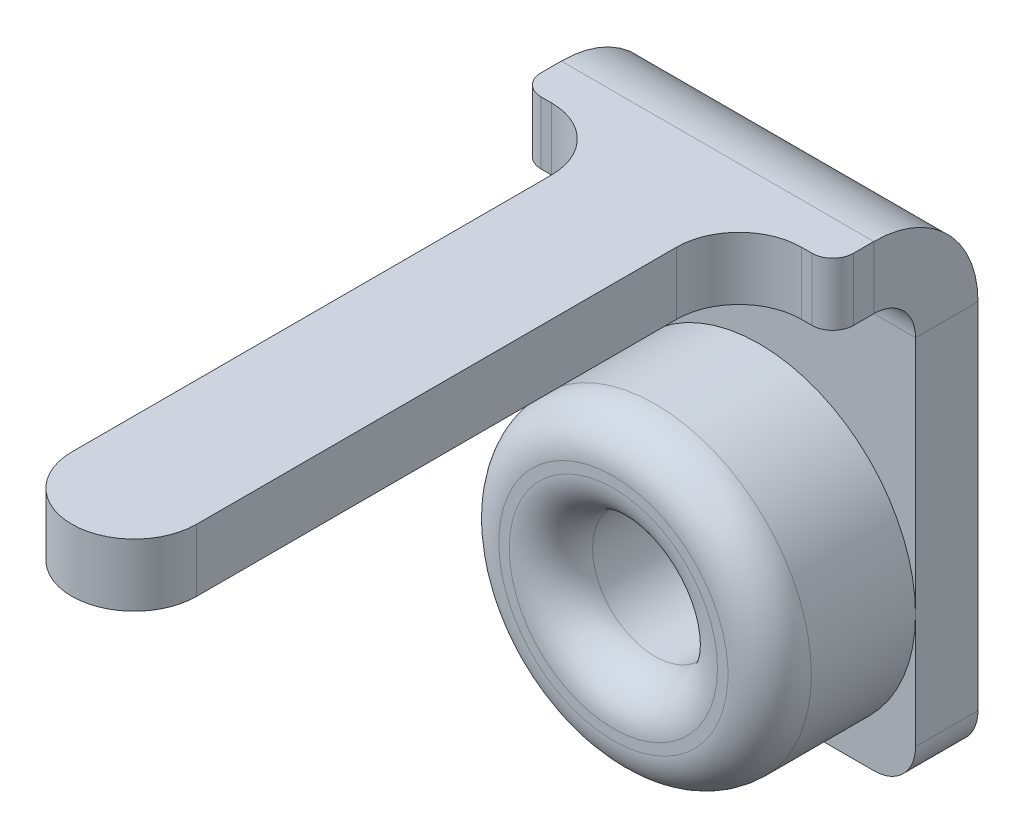
ISO-10303-21;
HEADER;
FILE_DESCRIPTION(('STEP AP214'),'2;1');
FILE_NAME('part.step','',(''),(''),'','','');
FILE_SCHEMA(('AUTOMOTIVE_DESIGN { 1 0 10303 214 1 1 1 1 }'));
ENDSEC;
DATA;
#1=APPLICATION_CONTEXT('core data for automotive mechanical design processes');
#2=APPLICATION_PROTOCOL_DEFINITION('international standard','automotive_design',2000,#1);
#3=PRODUCT_CONTEXT('',#1,'mechanical');
#4=PRODUCT('Part','Part','',(#3));
#5=PRODUCT_RELATED_PRODUCT_CATEGORY('part','',(#4));
#6=PRODUCT_DEFINITION_FORMATION('','',#4);
#7=PRODUCT_DEFINITION_CONTEXT('part definition',#1,'design');
#8=PRODUCT_DEFINITION('design','',#6,#7);
#9=PRODUCT_DEFINITION_SHAPE('','',#8);
#10=(LENGTH_UNIT() NAMED_UNIT(*) SI_UNIT(.MILLI.,.METRE.));
#11=(NAMED_UNIT(*) PLANE_ANGLE_UNIT() SI_UNIT($,.RADIAN.));
#12=(NAMED_UNIT(*) SI_UNIT($,.STERADIAN.) SOLID_ANGLE_UNIT());
#13=UNCERTAINTY_MEASURE_WITH_UNIT(LENGTH_MEASURE(1.E-05),#10,'distance_accuracy_value','');
#14=(GEOMETRIC_REPRESENTATION_CONTEXT(3) GLOBAL_UNCERTAINTY_ASSIGNED_CONTEXT((#13)) GLOBAL_UNIT_ASSIGNED_CONTEXT((#10,
#11,#12)) REPRESENTATION_CONTEXT('',''));
#15=CARTESIAN_POINT('',(0.,0.,0.));
#16=DIRECTION('',(0.,0.,1.));
#17=DIRECTION('',(1.,0.,0.));
#18=AXIS2_PLACEMENT_3D('',#15,#16,#17);
#19=CARTESIAN_POINT('',(0.,0.,0.8));
#20=DIRECTION('',(0.,0.,-1.));
#21=DIRECTION('',(0.,1.,0.));
#22=AXIS2_PLACEMENT_3D('',#19,#20,#21);
#23=TOROIDAL_SURFACE('',#22,0.5,0.2);
#24=CARTESIAN_POINT('',(0.,0.,1.));
#25=DIRECTION('',(0.,0.,-1.));
#26=DIRECTION('',(0.,1.,0.));
#27=AXIS2_PLACEMENT_3D('',#24,#25,#26);
#28=CIRCLE('',#27,0.5);
#29=CARTESIAN_POINT('',(0.,0.5,1.));
#30=VERTEX_POINT('',#29);
#31=EDGE_CURVE('E167',#30,#30,#28,.T.);
#32=ORIENTED_EDGE('',*,*,#31,.F.);
#33=EDGE_LOOP('',(#32));
#34=FACE_BOUND('',#33,.T.);
#35=CARTESIAN_POINT('',(0.,0.,0.8));
#36=DIRECTION('',(0.,0.,-1.));
#37=DIRECTION('',(0.,1.,0.));
#38=AXIS2_PLACEMENT_3D('',#35,#36,#37);
#39=CIRCLE('',#38,0.3);
#40=CARTESIAN_POINT('',(0.,0.3,0.8));
#41=VERTEX_POINT('',#40);
#42=EDGE_CURVE('E328',#41,#41,#39,.T.);
#43=ORIENTED_EDGE('',*,*,#42,.T.);
#44=EDGE_LOOP('',(#43));
#45=FACE_BOUND('',#44,.T.);
#46=ADVANCED_FACE('F17',(#34,#45),#23,.T.);
#47=CARTESIAN_POINT('',(0.,0.,0.2));
#48=DIRECTION('',(0.,0.,-1.));
#49=DIRECTION('',(0.,1.,0.));
#50=AXIS2_PLACEMENT_3D('',#47,#48,#49);
#51=TOROIDAL_SURFACE('',#50,0.5,0.2);
#52=CARTESIAN_POINT('',(0.,0.,0.));
#53=DIRECTION('',(0.,0.,1.));
#54=DIRECTION('',(0.,1.,0.));
#55=AXIS2_PLACEMENT_3D('',#52,#53,#54);
#56=CIRCLE('',#55,0.5);
#57=CARTESIAN_POINT('',(0.,0.5,0.));
#58=VERTEX_POINT('',#57);
#59=EDGE_CURVE('E255',#58,#58,#56,.T.);
#60=ORIENTED_EDGE('',*,*,#59,.F.);
#61=EDGE_LOOP('',(#60));
#62=FACE_BOUND('',#61,.T.);
#63=CARTESIAN_POINT('',(0.,0.,0.2));
#64=DIRECTION('',(0.,0.,1.));
#65=DIRECTION('',(0.,1.,0.));
#66=AXIS2_PLACEMENT_3D('',#63,#64,#65);
#67=CIRCLE('',#66,0.3);
#68=CARTESIAN_POINT('',(0.,0.3,0.2));
#69=VERTEX_POINT('',#68);
#70=EDGE_CURVE('E332',#69,#69,#67,.T.);
#71=ORIENTED_EDGE('',*,*,#70,.T.);
#72=EDGE_LOOP('',(#71));
#73=FACE_BOUND('',#72,.T.);
#74=ADVANCED_FACE('F703',(#62,#73),#51,.T.);
#75=CARTESIAN_POINT('',(0.75,1.15,0.));
#76=DIRECTION('',(1.,0.,0.));
#77=DIRECTION('',(0.,-1.,0.));
#78=AXIS2_PLACEMENT_3D('',#75,#76,#77);
#79=PLANE('',#78);
#80=CARTESIAN_POINT('',(0.75,1.15,0.5));
#81=DIRECTION('',(1.,0.,0.));
#82=DIRECTION('',(0.,0.,-1.));
#83=AXIS2_PLACEMENT_3D('',#80,#81,#82);
#84=CIRCLE('',#83,0.5);
#85=CARTESIAN_POINT('',(0.75,1.15,0.));
#86=VERTEX_POINT('',#85);
#87=CARTESIAN_POINT('',(0.75,1.65,0.5));
#88=VERTEX_POINT('',#87);
#89=EDGE_CURVE('E400',#86,#88,#84,.T.);
#90=ORIENTED_EDGE('',*,*,#89,.T.);
#91=DIRECTION('',(0.,1.,0.));
#92=VECTOR('',#91,1.);
#93=CARTESIAN_POINT('',(0.75,1.35,0.5));
#94=LINE('',#93,#92);
#95=CARTESIAN_POINT('',(0.75,1.35,0.5));
#96=VERTEX_POINT('',#95);
#97=EDGE_CURVE('E171',#96,#88,#94,.T.);
#98=ORIENTED_EDGE('',*,*,#97,.F.);
#99=CARTESIAN_POINT('',(0.75,1.15,0.5));
#100=DIRECTION('',(1.,0.,0.));
#101=DIRECTION('',(0.,0.,-1.));
#102=AXIS2_PLACEMENT_3D('',#99,#100,#101);
#103=CIRCLE('',#102,0.2);
#104=CARTESIAN_POINT('',(0.75,1.15,0.3));
#105=VERTEX_POINT('',#104);
#106=EDGE_CURVE('E244',#105,#96,#103,.T.);
#107=ORIENTED_EDGE('',*,*,#106,.F.);
#108=DIRECTION('',(0.,0.,-1.));
#109=VECTOR('',#108,1.);
#110=CARTESIAN_POINT('',(0.75,1.15,0.3));
#111=LINE('',#110,#109);
#112=EDGE_CURVE('E261',#105,#86,#111,.T.);
#113=ORIENTED_EDGE('',*,*,#112,.T.);
#114=EDGE_LOOP('',(#90,#98,#107,#113));
#115=FACE_BOUND('',#114,.T.);
#116=ADVANCED_FACE('F709',(#115),#79,.T.);
#117=CARTESIAN_POINT('',(-0.75,1.15,0.3));
#118=DIRECTION('',(-1.,0.,0.));
#119=DIRECTION('',(0.,0.,1.));
#120=AXIS2_PLACEMENT_3D('',#117,#118,#119);
#121=PLANE('',#120);
#122=CARTESIAN_POINT('',(-0.75,1.15,0.5));
#123=DIRECTION('',(-1.,0.,0.));
#124=DIRECTION('',(0.,1.,0.));
#125=AXIS2_PLACEMENT_3D('',#122,#123,#124);
#126=CIRCLE('',#125,0.2);
#127=CARTESIAN_POINT('',(-0.75,1.35,0.5));
#128=VERTEX_POINT('',#127);
#129=CARTESIAN_POINT('',(-0.75,1.15,0.3));
#130=VERTEX_POINT('',#129);
#131=EDGE_CURVE('E241',#128,#130,#126,.T.);
#132=ORIENTED_EDGE('',*,*,#131,.F.);
#133=DIRECTION('',(0.,1.,0.));
#134=VECTOR('',#133,1.);
#135=CARTESIAN_POINT('',(-0.75,1.35,0.5));
#136=LINE('',#135,#134);
#137=CARTESIAN_POINT('',(-0.75,1.65,0.5));
#138=VERTEX_POINT('',#137);
#139=EDGE_CURVE('E338',#128,#138,#136,.T.);
#140=ORIENTED_EDGE('',*,*,#139,.T.);
#141=CARTESIAN_POINT('',(-0.75,1.15,0.5));
#142=DIRECTION('',(-1.,0.,0.));
#143=DIRECTION('',(0.,1.,0.));
#144=AXIS2_PLACEMENT_3D('',#141,#142,#143);
#145=CIRCLE('',#144,0.5);
#146=CARTESIAN_POINT('',(-0.75,1.15,0.));
#147=VERTEX_POINT('',#146);
#148=EDGE_CURVE('E179',#138,#147,#145,.T.);
#149=ORIENTED_EDGE('',*,*,#148,.T.);
#150=DIRECTION('',(0.,0.,-1.));
#151=VECTOR('',#150,1.);
#152=CARTESIAN_POINT('',(-0.75,1.15,0.3));
#153=LINE('',#152,#151);
#154=EDGE_CURVE('E196',#130,#147,#153,.T.);
#155=ORIENTED_EDGE('',*,*,#154,.F.);
#156=EDGE_LOOP('',(#132,#140,#149,#155));
#157=FACE_BOUND('',#156,.T.);
#158=ADVANCED_FACE('F371',(#157),#121,.T.);
#159=CARTESIAN_POINT('',(0.,1.65,-1.15265482457437));
#160=DIRECTION('',(0.,-1.,0.));
#161=DIRECTION('',(0.,0.,-1.));
#162=AXIS2_PLACEMENT_3D('',#159,#160,#161);
#163=PLANE('',#162);
#164=DIRECTION('',(-1.,0.,0.));
#165=VECTOR('',#164,1.);
#166=CARTESIAN_POINT('',(0.75,1.65,0.5));
#167=LINE('',#166,#165);
#168=EDGE_CURVE('E21',#88,#138,#167,.T.);
#169=ORIENTED_EDGE('',*,*,#168,.T.);
#170=DIRECTION('',(0.,0.,-1.));
#171=VECTOR('',#170,1.);
#172=CARTESIAN_POINT('',(-0.75,1.65,0.597345175425633));
#173=LINE('',#172,#171);
#174=CARTESIAN_POINT('',(-0.75,1.65,0.597345175425633));
#175=VERTEX_POINT('',#174);
#176=EDGE_CURVE('E218',#175,#138,#173,.T.);
#177=ORIENTED_EDGE('',*,*,#176,.F.);
#178=CARTESIAN_POINT('',(-0.65,1.65,0.597345175425633));
#179=DIRECTION('',(0.,-1.,0.));
#180=DIRECTION('',(0.,0.,1.));
#181=AXIS2_PLACEMENT_3D('',#178,#179,#180);
#182=CIRCLE('',#181,0.1);
#183=CARTESIAN_POINT('',(-0.65,1.65,0.697345175425633));
#184=VERTEX_POINT('',#183);
#185=EDGE_CURVE('E214',#184,#175,#182,.T.);
#186=ORIENTED_EDGE('',*,*,#185,.F.);
#187=DIRECTION('',(-1.,0.,0.));
#188=VECTOR('',#187,1.);
#189=CARTESIAN_POINT('',(-0.6,1.65,0.697345175425633));
#190=LINE('',#189,#188);
#191=CARTESIAN_POINT('',(-0.6,1.65,0.697345175425633));
#192=VERTEX_POINT('',#191);
#193=EDGE_CURVE('E197',#192,#184,#190,.T.);
#194=ORIENTED_EDGE('',*,*,#193,.F.);
#195=CARTESIAN_POINT('',(-0.6,1.65,0.997345175425634));
#196=DIRECTION('',(0.,1.,0.));
#197=DIRECTION('',(1.,0.,0.));
#198=AXIS2_PLACEMENT_3D('',#195,#196,#197);
#199=CIRCLE('',#198,0.3);
#200=CARTESIAN_POINT('',(-0.3,1.65,0.997345175425634));
#201=VERTEX_POINT('',#200);
#202=EDGE_CURVE('E233',#201,#192,#199,.T.);
#203=ORIENTED_EDGE('',*,*,#202,.F.);
#204=DIRECTION('',(0.,0.,-1.));
#205=VECTOR('',#204,1.);
#206=CARTESIAN_POINT('',(-0.3,1.65,3.30000017542563));
#207=LINE('',#206,#205);
#208=CARTESIAN_POINT('',(-0.3,1.65,3.30000017542563));
#209=VERTEX_POINT('',#208);
#210=EDGE_CURVE('E185',#209,#201,#207,.T.);
#211=ORIENTED_EDGE('',*,*,#210,.F.);
#212=CARTESIAN_POINT('',(0.,1.65,3.30000017542563));
#213=DIRECTION('',(0.,-1.,0.));
#214=DIRECTION('',(1.,0.,0.));
#215=AXIS2_PLACEMENT_3D('',#212,#213,#214);
#216=CIRCLE('',#215,0.3);
#217=CARTESIAN_POINT('',(0.3,1.65,3.30000017542563));
#218=VERTEX_POINT('',#217);
#219=EDGE_CURVE('E271',#218,#209,#216,.T.);
#220=ORIENTED_EDGE('',*,*,#219,.F.);
#221=DIRECTION('',(0.,0.,1.));
#222=VECTOR('',#221,1.);
#223=CARTESIAN_POINT('',(0.3,1.65,0.997345175425632));
#224=LINE('',#223,#222);
#225=CARTESIAN_POINT('',(0.3,1.65,0.997345175425632));
#226=VERTEX_POINT('',#225);
#227=EDGE_CURVE('E533',#226,#218,#224,.T.);
#228=ORIENTED_EDGE('',*,*,#227,.F.);
#229=CARTESIAN_POINT('',(0.6,1.65,0.997345175425633));
#230=DIRECTION('',(0.,1.,0.));
#231=DIRECTION('',(0.,0.,-1.));
#232=AXIS2_PLACEMENT_3D('',#229,#230,#231);
#233=CIRCLE('',#232,0.3);
#234=CARTESIAN_POINT('',(0.6,1.65,0.697345175425633));
#235=VERTEX_POINT('',#234);
#236=EDGE_CURVE('E347',#235,#226,#233,.T.);
#237=ORIENTED_EDGE('',*,*,#236,.F.);
#238=DIRECTION('',(-1.,0.,0.));
#239=VECTOR('',#238,1.);
#240=CARTESIAN_POINT('',(0.65,1.65,0.697345175425633));
#241=LINE('',#240,#239);
#242=CARTESIAN_POINT('',(0.65,1.65,0.697345175425633));
#243=VERTEX_POINT('',#242);
#244=EDGE_CURVE('E157',#243,#235,#241,.T.);
#245=ORIENTED_EDGE('',*,*,#244,.F.);
#246=CARTESIAN_POINT('',(0.65,1.65,0.597345175425633));
#247=DIRECTION('',(0.,-1.,0.));
#248=DIRECTION('',(1.,0.,0.));
#249=AXIS2_PLACEMENT_3D('',#246,#247,#248);
#250=CIRCLE('',#249,0.1);
#251=CARTESIAN_POINT('',(0.75,1.65,0.597345175425633));
#252=VERTEX_POINT('',#251);
#253=EDGE_CURVE('E11',#252,#243,#250,.T.);
#254=ORIENTED_EDGE('',*,*,#253,.F.);
#255=DIRECTION('',(0.,0.,1.));
#256=VECTOR('',#255,1.);
#257=CARTESIAN_POINT('',(0.75,1.65,0.5));
#258=LINE('',#257,#256);
#259=EDGE_CURVE('E154',#88,#252,#258,.T.);
#260=ORIENTED_EDGE('',*,*,#259,.F.);
#261=EDGE_LOOP('',(#169,#177,#186,#194,#203,#211,#220,#228,#237,#245,#254,#260));
#262=FACE_BOUND('',#261,.T.);
#263=ADVANCED_FACE('F152',(#262),#163,.F.);
#264=CARTESIAN_POINT('',(0.65,1.65,0.597345175425633));
#265=DIRECTION('',(0.,-1.,0.));
#266=DIRECTION('',(1.,0.,0.));
#267=AXIS2_PLACEMENT_3D('',#264,#265,#266);
#268=CYLINDRICAL_SURFACE('',#267,0.1);
#269=ORIENTED_EDGE('',*,*,#253,.T.);
#270=DIRECTION('',(0.,-1.,0.));
#271=VECTOR('',#270,1.);
#272=CARTESIAN_POINT('',(0.65,1.65,0.697345175425633));
#273=LINE('',#272,#271);
#274=CARTESIAN_POINT('',(0.65,1.35,0.697345175425633));
#275=VERTEX_POINT('',#274);
#276=EDGE_CURVE('E28',#243,#275,#273,.T.);
#277=ORIENTED_EDGE('',*,*,#276,.T.);
#278=CARTESIAN_POINT('',(0.65,1.35,0.597345175425633));
#279=DIRECTION('',(0.,-1.,0.));
#280=DIRECTION('',(1.,0.,0.));
#281=AXIS2_PLACEMENT_3D('',#278,#279,#280);
#282=CIRCLE('',#281,0.1);
#283=CARTESIAN_POINT('',(0.75,1.35,0.597345175425633));
#284=VERTEX_POINT('',#283);
#285=EDGE_CURVE('E162',#284,#275,#282,.T.);
#286=ORIENTED_EDGE('',*,*,#285,.F.);
#287=DIRECTION('',(0.,-1.,0.));
#288=VECTOR('',#287,1.);
#289=CARTESIAN_POINT('',(0.75,1.65,0.597345175425633));
#290=LINE('',#289,#288);
#291=EDGE_CURVE('E159',#252,#284,#290,.T.);
#292=ORIENTED_EDGE('',*,*,#291,.F.);
#293=EDGE_LOOP('',(#269,#277,#286,#292));
#294=FACE_BOUND('',#293,.T.);
#295=ADVANCED_FACE('F160',(#294),#268,.T.);
#296=CARTESIAN_POINT('',(0.65,1.65,0.697345175425633));
#297=DIRECTION('',(0.,0.,1.));
#298=DIRECTION('',(1.,0.,0.));
#299=AXIS2_PLACEMENT_3D('',#296,#297,#298);
#300=PLANE('',#299);
#301=ORIENTED_EDGE('',*,*,#244,.T.);
#302=DIRECTION('',(0.,-1.,0.));
#303=VECTOR('',#302,1.);
#304=CARTESIAN_POINT('',(0.6,1.65,0.697345175425633));
#305=LINE('',#304,#303);
#306=CARTESIAN_POINT('',(0.6,1.35,0.697345175425633));
#307=VERTEX_POINT('',#306);
#308=EDGE_CURVE('E270',#235,#307,#305,.T.);
#309=ORIENTED_EDGE('',*,*,#308,.T.);
#310=DIRECTION('',(-1.,0.,0.));
#311=VECTOR('',#310,1.);
#312=CARTESIAN_POINT('',(0.65,1.35,0.697345175425633));
#313=LINE('',#312,#311);
#314=EDGE_CURVE('E209',#275,#307,#313,.T.);
#315=ORIENTED_EDGE('',*,*,#314,.F.);
#316=ORIENTED_EDGE('',*,*,#276,.F.);
#317=EDGE_LOOP('',(#301,#309,#315,#316));
#318=FACE_BOUND('',#317,.T.);
#319=ADVANCED_FACE('F724',(#318),#300,.T.);
#320=CARTESIAN_POINT('',(0.6,1.65,0.997345175425633));
#321=DIRECTION('',(0.,1.,0.));
#322=DIRECTION('',(0.,0.,-1.));
#323=AXIS2_PLACEMENT_3D('',#320,#321,#322);
#324=CYLINDRICAL_SURFACE('',#323,0.3);
#325=ORIENTED_EDGE('',*,*,#236,.T.);
#326=DIRECTION('',(0.,-1.,0.));
#327=VECTOR('',#326,1.);
#328=CARTESIAN_POINT('',(0.3,1.65,0.997345175425632));
#329=LINE('',#328,#327);
#330=CARTESIAN_POINT('',(0.3,1.35,0.997345175425632));
#331=VERTEX_POINT('',#330);
#332=EDGE_CURVE('E351',#226,#331,#329,.T.);
#333=ORIENTED_EDGE('',*,*,#332,.T.);
#334=CARTESIAN_POINT('',(0.6,1.35,0.997345175425633));
#335=DIRECTION('',(0.,1.,0.));
#336=DIRECTION('',(0.,0.,-1.));
#337=AXIS2_PLACEMENT_3D('',#334,#335,#336);
#338=CIRCLE('',#337,0.3);
#339=EDGE_CURVE('E213',#307,#331,#338,.T.);
#340=ORIENTED_EDGE('',*,*,#339,.F.);
#341=ORIENTED_EDGE('',*,*,#308,.F.);
#342=EDGE_LOOP('',(#325,#333,#340,#341));
#343=FACE_BOUND('',#342,.T.);
#344=ADVANCED_FACE('F721',(#343),#324,.F.);
#345=CARTESIAN_POINT('',(0.3,1.65,0.997345175425632));
#346=DIRECTION('',(1.,0.,0.));
#347=DIRECTION('',(0.,0.,-1.));
#348=AXIS2_PLACEMENT_3D('',#345,#346,#347);
#349=PLANE('',#348);
#350=ORIENTED_EDGE('',*,*,#227,.T.);
#351=DIRECTION('',(0.,-1.,0.));
#352=VECTOR('',#351,1.);
#353=CARTESIAN_POINT('',(0.3,1.65,3.30000017542563));
#354=LINE('',#353,#352);
#355=CARTESIAN_POINT('',(0.3,1.35,3.30000017542563));
#356=VERTEX_POINT('',#355);
#357=EDGE_CURVE('E274',#218,#356,#354,.T.);
#358=ORIENTED_EDGE('',*,*,#357,.T.);
#359=DIRECTION('',(0.,0.,1.));
#360=VECTOR('',#359,1.);
#361=CARTESIAN_POINT('',(0.3,1.35,0.997345175425632));
#362=LINE('',#361,#360);
#363=EDGE_CURVE('E312',#331,#356,#362,.T.);
#364=ORIENTED_EDGE('',*,*,#363,.F.);
#365=ORIENTED_EDGE('',*,*,#332,.F.);
#366=EDGE_LOOP('',(#350,#358,#364,#365));
#367=FACE_BOUND('',#366,.T.);
#368=ADVANCED_FACE('F723',(#367),#349,.T.);
#369=CARTESIAN_POINT('',(0.,1.65,3.30000017542563));
#370=DIRECTION('',(0.,-1.,0.));
#371=DIRECTION('',(1.,0.,0.));
#372=AXIS2_PLACEMENT_3D('',#369,#370,#371);
#373=CYLINDRICAL_SURFACE('',#372,0.3);
#374=ORIENTED_EDGE('',*,*,#219,.T.);
#375=DIRECTION('',(0.,-1.,0.));
#376=VECTOR('',#375,1.);
#377=CARTESIAN_POINT('',(-0.3,1.65,3.30000017542563));
#378=LINE('',#377,#376);
#379=CARTESIAN_POINT('',(-0.3,1.35,3.30000017542563));
#380=VERTEX_POINT('',#379);
#381=EDGE_CURVE('E189',#209,#380,#378,.T.);
#382=ORIENTED_EDGE('',*,*,#381,.T.);
#383=CARTESIAN_POINT('',(0.,1.35,3.30000017542563));
#384=DIRECTION('',(0.,-1.,0.));
#385=DIRECTION('',(1.,0.,0.));
#386=AXIS2_PLACEMENT_3D('',#383,#384,#385);
#387=CIRCLE('',#386,0.3);
#388=EDGE_CURVE('E316',#356,#380,#387,.T.);
#389=ORIENTED_EDGE('',*,*,#388,.F.);
#390=ORIENTED_EDGE('',*,*,#357,.F.);
#391=EDGE_LOOP('',(#374,#382,#389,#390));
#392=FACE_BOUND('',#391,.T.);
#393=ADVANCED_FACE('F730',(#392),#373,.T.);
#394=CARTESIAN_POINT('',(-0.3,1.65,3.30000017542563));
#395=DIRECTION('',(-1.,0.,0.));
#396=DIRECTION('',(0.,0.,1.));
#397=AXIS2_PLACEMENT_3D('',#394,#395,#396);
#398=PLANE('',#397);
#399=ORIENTED_EDGE('',*,*,#210,.T.);
#400=DIRECTION('',(0.,-1.,0.));
#401=VECTOR('',#400,1.);
#402=CARTESIAN_POINT('',(-0.3,1.65,0.997345175425632));
#403=LINE('',#402,#401);
#404=CARTESIAN_POINT('',(-0.3,1.35,0.997345175425634));
#405=VERTEX_POINT('',#404);
#406=EDGE_CURVE('E190',#201,#405,#403,.T.);
#407=ORIENTED_EDGE('',*,*,#406,.T.);
#408=DIRECTION('',(0.,0.,-1.));
#409=VECTOR('',#408,1.);
#410=CARTESIAN_POINT('',(-0.3,1.35,3.30000017542563));
#411=LINE('',#410,#409);
#412=EDGE_CURVE('E327',#380,#405,#411,.T.);
#413=ORIENTED_EDGE('',*,*,#412,.F.);
#414=ORIENTED_EDGE('',*,*,#381,.F.);
#415=EDGE_LOOP('',(#399,#407,#413,#414));
#416=FACE_BOUND('',#415,.T.);
#417=ADVANCED_FACE('F636',(#416),#398,.T.);
#418=CARTESIAN_POINT('',(-0.6,1.65,0.997345175425634));
#419=DIRECTION('',(0.,1.,0.));
#420=DIRECTION('',(1.,0.,0.));
#421=AXIS2_PLACEMENT_3D('',#418,#419,#420);
#422=CYLINDRICAL_SURFACE('',#421,0.3);
#423=ORIENTED_EDGE('',*,*,#202,.T.);
#424=DIRECTION('',(0.,-1.,0.));
#425=VECTOR('',#424,1.);
#426=CARTESIAN_POINT('',(-0.6,1.65,0.697345175425633));
#427=LINE('',#426,#425);
#428=CARTESIAN_POINT('',(-0.6,1.35,0.697345175425633));
#429=VERTEX_POINT('',#428);
#430=EDGE_CURVE('E201',#192,#429,#427,.T.);
#431=ORIENTED_EDGE('',*,*,#430,.T.);
#432=CARTESIAN_POINT('',(-0.6,1.35,0.997345175425634));
#433=DIRECTION('',(0.,1.,0.));
#434=DIRECTION('',(1.,0.,0.));
#435=AXIS2_PLACEMENT_3D('',#432,#433,#434);
#436=CIRCLE('',#435,0.3);
#437=EDGE_CURVE('E522',#405,#429,#436,.T.);
#438=ORIENTED_EDGE('',*,*,#437,.F.);
#439=ORIENTED_EDGE('',*,*,#406,.F.);
#440=EDGE_LOOP('',(#423,#431,#438,#439));
#441=FACE_BOUND('',#440,.T.);
#442=ADVANCED_FACE('F619',(#441),#422,.F.);
#443=CARTESIAN_POINT('',(-0.6,1.65,0.697345175425633));
#444=DIRECTION('',(0.,0.,1.));
#445=DIRECTION('',(0.,-1.,0.));
#446=AXIS2_PLACEMENT_3D('',#443,#444,#445);
#447=PLANE('',#446);
#448=ORIENTED_EDGE('',*,*,#193,.T.);
#449=DIRECTION('',(0.,-1.,0.));
#450=VECTOR('',#449,1.);
#451=CARTESIAN_POINT('',(-0.65,1.65,0.697345175425633));
#452=LINE('',#451,#450);
#453=CARTESIAN_POINT('',(-0.65,1.35,0.697345175425633));
#454=VERTEX_POINT('',#453);
#455=EDGE_CURVE('E202',#184,#454,#452,.T.);
#456=ORIENTED_EDGE('',*,*,#455,.T.);
#457=DIRECTION('',(-1.,0.,0.));
#458=VECTOR('',#457,1.);
#459=CARTESIAN_POINT('',(-0.6,1.35,0.697345175425633));
#460=LINE('',#459,#458);
#461=EDGE_CURVE('E251',#429,#454,#460,.T.);
#462=ORIENTED_EDGE('',*,*,#461,.F.);
#463=ORIENTED_EDGE('',*,*,#430,.F.);
#464=EDGE_LOOP('',(#448,#456,#462,#463));
#465=FACE_BOUND('',#464,.T.);
#466=ADVANCED_FACE('F627',(#465),#447,.T.);
#467=CARTESIAN_POINT('',(-0.65,1.65,0.597345175425633));
#468=DIRECTION('',(0.,-1.,0.));
#469=DIRECTION('',(0.,0.,1.));
#470=AXIS2_PLACEMENT_3D('',#467,#468,#469);
#471=CYLINDRICAL_SURFACE('',#470,0.1);
#472=ORIENTED_EDGE('',*,*,#185,.T.);
#473=DIRECTION('',(0.,-1.,0.));
#474=VECTOR('',#473,1.);
#475=CARTESIAN_POINT('',(-0.75,1.65,0.597345175425633));
#476=LINE('',#475,#474);
#477=CARTESIAN_POINT('',(-0.75,1.35,0.597345175425633));
#478=VERTEX_POINT('',#477);
#479=EDGE_CURVE('E341',#175,#478,#476,.T.);
#480=ORIENTED_EDGE('',*,*,#479,.T.);
#481=CARTESIAN_POINT('',(-0.65,1.35,0.597345175425633));
#482=DIRECTION('',(0.,-1.,0.));
#483=DIRECTION('',(0.,0.,1.));
#484=AXIS2_PLACEMENT_3D('',#481,#482,#483);
#485=CIRCLE('',#484,0.1);
#486=EDGE_CURVE('E246',#454,#478,#485,.T.);
#487=ORIENTED_EDGE('',*,*,#486,.F.);
#488=ORIENTED_EDGE('',*,*,#455,.F.);
#489=EDGE_LOOP('',(#472,#480,#487,#488));
#490=FACE_BOUND('',#489,.T.);
#491=ADVANCED_FACE('F647',(#490),#471,.T.);
#492=CARTESIAN_POINT('',(-0.75,1.65,0.597345175425633));
#493=DIRECTION('',(-1.,0.,0.));
#494=DIRECTION('',(0.,1.,0.));
#495=AXIS2_PLACEMENT_3D('',#492,#493,#494);
#496=PLANE('',#495);
#497=ORIENTED_EDGE('',*,*,#139,.F.);
#498=DIRECTION('',(0.,0.,-1.));
#499=VECTOR('',#498,1.);
#500=CARTESIAN_POINT('',(-0.75,1.35,0.597345175425633));
#501=LINE('',#500,#499);
#502=EDGE_CURVE('E250',#478,#128,#501,.T.);
#503=ORIENTED_EDGE('',*,*,#502,.F.);
#504=ORIENTED_EDGE('',*,*,#479,.F.);
#505=ORIENTED_EDGE('',*,*,#176,.T.);
#506=EDGE_LOOP('',(#497,#503,#504,#505));
#507=FACE_BOUND('',#506,.T.);
#508=ADVANCED_FACE('F19',(#507),#496,.T.);
#509=CARTESIAN_POINT('',(0.,0.,1.));
#510=DIRECTION('',(0.,0.,1.));
#511=DIRECTION('',(1.,0.,0.));
#512=AXIS2_PLACEMENT_3D('',#509,#510,#511);
#513=PLANE('',#512);
#514=ORIENTED_EDGE('',*,*,#31,.T.);
#515=EDGE_LOOP('',(#514));
#516=FACE_BOUND('',#515,.T.);
#517=CARTESIAN_POINT('',(0.,0.,1.));
#518=DIRECTION('',(0.,0.,1.));
#519=DIRECTION('',(0.,1.,0.));
#520=AXIS2_PLACEMENT_3D('',#517,#518,#519);
#521=CIRCLE('',#520,0.55);
#522=CARTESIAN_POINT('',(0.,0.55,1.));
#523=VERTEX_POINT('',#522);
#524=EDGE_CURVE('E304',#523,#523,#521,.T.);
#525=ORIENTED_EDGE('',*,*,#524,.T.);
#526=EDGE_LOOP('',(#525));
#527=FACE_BOUND('',#526,.T.);
#528=ADVANCED_FACE('F685',(#516,#527),#513,.T.);
#529=CARTESIAN_POINT('',(0.75,1.65,-1.70265482457437));
#530=DIRECTION('',(1.,0.,0.));
#531=DIRECTION('',(0.,0.,-1.));
#532=AXIS2_PLACEMENT_3D('',#529,#530,#531);
#533=PLANE('',#532);
#534=ORIENTED_EDGE('',*,*,#97,.T.);
#535=ORIENTED_EDGE('',*,*,#259,.T.);
#536=ORIENTED_EDGE('',*,*,#291,.T.);
#537=DIRECTION('',(0.,0.,1.));
#538=VECTOR('',#537,1.);
#539=CARTESIAN_POINT('',(0.75,1.35,0.5));
#540=LINE('',#539,#538);
#541=EDGE_CURVE('E303',#96,#284,#540,.T.);
#542=ORIENTED_EDGE('',*,*,#541,.F.);
#543=EDGE_LOOP('',(#534,#535,#536,#542));
#544=FACE_BOUND('',#543,.T.);
#545=ADVANCED_FACE('F169',(#544),#533,.T.);
#546=CARTESIAN_POINT('',(0.75,1.15,0.5));
#547=DIRECTION('',(1.,0.,0.));
#548=DIRECTION('',(0.,0.,-1.));
#549=AXIS2_PLACEMENT_3D('',#546,#547,#548);
#550=CYLINDRICAL_SURFACE('',#549,0.5);
#551=ORIENTED_EDGE('',*,*,#168,.F.);
#552=ORIENTED_EDGE('',*,*,#89,.F.);
#553=DIRECTION('',(-1.,0.,0.));
#554=VECTOR('',#553,1.);
#555=CARTESIAN_POINT('',(0.75,1.15,0.));
#556=LINE('',#555,#554);
#557=EDGE_CURVE('E275',#86,#147,#556,.T.);
#558=ORIENTED_EDGE('',*,*,#557,.T.);
#559=ORIENTED_EDGE('',*,*,#148,.F.);
#560=EDGE_LOOP('',(#551,#552,#558,#559));
#561=FACE_BOUND('',#560,.T.);
#562=ADVANCED_FACE('F719',(#561),#550,.T.);
#563=CARTESIAN_POINT('',(-0.55,-0.75,0.));
#564=DIRECTION('',(0.,-1.,0.));
#565=DIRECTION('',(-1.,0.,0.));
#566=AXIS2_PLACEMENT_3D('',#563,#564,#565);
#567=PLANE('',#566);
#568=DIRECTION('',(1.,0.,0.));
#569=VECTOR('',#568,1.);
#570=CARTESIAN_POINT('',(-0.55,-0.75,0.));
#571=LINE('',#570,#569);
#572=CARTESIAN_POINT('',(-0.55,-0.75,0.));
#573=VERTEX_POINT('',#572);
#574=CARTESIAN_POINT('',(0.55,-0.75,0.));
#575=VERTEX_POINT('',#574);
#576=EDGE_CURVE('E221',#573,#575,#571,.T.);
#577=ORIENTED_EDGE('',*,*,#576,.T.);
#578=DIRECTION('',(0.,0.,1.));
#579=VECTOR('',#578,1.);
#580=CARTESIAN_POINT('',(0.55,-0.75,0.));
#581=LINE('',#580,#579);
#582=CARTESIAN_POINT('',(0.55,-0.75,0.3));
#583=VERTEX_POINT('',#582);
#584=EDGE_CURVE('E203',#575,#583,#581,.T.);
#585=ORIENTED_EDGE('',*,*,#584,.T.);
#586=DIRECTION('',(1.,0.,0.));
#587=VECTOR('',#586,1.);
#588=CARTESIAN_POINT('',(0.,-0.75,0.3));
#589=LINE('',#588,#587);
#590=CARTESIAN_POINT('',(0.,-0.75,0.3));
#591=VERTEX_POINT('',#590);
#592=EDGE_CURVE('E207',#591,#583,#589,.T.);
#593=ORIENTED_EDGE('',*,*,#592,.F.);
#594=DIRECTION('',(1.,0.,0.));
#595=VECTOR('',#594,1.);
#596=CARTESIAN_POINT('',(-0.55,-0.75,0.3));
#597=LINE('',#596,#595);
#598=CARTESIAN_POINT('',(-0.55,-0.75,0.3));
#599=VERTEX_POINT('',#598);
#600=EDGE_CURVE('E310',#599,#591,#597,.T.);
#601=ORIENTED_EDGE('',*,*,#600,.F.);
#602=DIRECTION('',(0.,0.,1.));
#603=VECTOR('',#602,1.);
#604=CARTESIAN_POINT('',(-0.55,-0.75,0.));
#605=LINE('',#604,#603);
#606=EDGE_CURVE('E299',#573,#599,#605,.T.);
#607=ORIENTED_EDGE('',*,*,#606,.F.);
#608=EDGE_LOOP('',(#577,#585,#593,#601,#607));
#609=FACE_BOUND('',#608,.T.);
#610=ADVANCED_FACE('F716',(#609),#567,.T.);
#611=CARTESIAN_POINT('',(0.,0.,1.));
#612=DIRECTION('',(0.,0.,-1.));
#613=DIRECTION('',(0.,1.,0.));
#614=AXIS2_PLACEMENT_3D('',#611,#612,#613);
#615=CYLINDRICAL_SURFACE('',#614,0.3);
#616=ORIENTED_EDGE('',*,*,#42,.F.);
#617=EDGE_LOOP('',(#616));
#618=FACE_BOUND('',#617,.T.);
#619=ORIENTED_EDGE('',*,*,#70,.F.);
#620=EDGE_LOOP('',(#619));
#621=FACE_BOUND('',#620,.T.);
#622=ADVANCED_FACE('F718',(#618,#621),#615,.F.);
#623=CARTESIAN_POINT('',(0.,1.35,-1.15265482457437));
#624=DIRECTION('',(0.,-1.,0.));
#625=DIRECTION('',(0.,0.,-1.));
#626=AXIS2_PLACEMENT_3D('',#623,#624,#625);
#627=PLANE('',#626);
#628=DIRECTION('',(-1.,0.,0.));
#629=VECTOR('',#628,1.);
#630=CARTESIAN_POINT('',(0.75,1.35,0.5));
#631=LINE('',#630,#629);
#632=EDGE_CURVE('E245',#96,#128,#631,.T.);
#633=ORIENTED_EDGE('',*,*,#632,.F.);
#634=ORIENTED_EDGE('',*,*,#541,.T.);
#635=ORIENTED_EDGE('',*,*,#285,.T.);
#636=ORIENTED_EDGE('',*,*,#314,.T.);
#637=ORIENTED_EDGE('',*,*,#339,.T.);
#638=ORIENTED_EDGE('',*,*,#363,.T.);
#639=ORIENTED_EDGE('',*,*,#388,.T.);
#640=ORIENTED_EDGE('',*,*,#412,.T.);
#641=ORIENTED_EDGE('',*,*,#437,.T.);
#642=ORIENTED_EDGE('',*,*,#461,.T.);
#643=ORIENTED_EDGE('',*,*,#486,.T.);
#644=ORIENTED_EDGE('',*,*,#502,.T.);
#645=EDGE_LOOP('',(#633,#634,#635,#636,#637,#638,#639,#640,#641,#642,#643,#644));
#646=FACE_BOUND('',#645,.T.);
#647=ADVANCED_FACE('F631',(#646),#627,.T.);
#648=CARTESIAN_POINT('',(-0.55,-0.55,0.));
#649=DIRECTION('',(0.,0.,1.));
#650=DIRECTION('',(-1.,0.,0.));
#651=AXIS2_PLACEMENT_3D('',#648,#649,#650);
#652=CYLINDRICAL_SURFACE('',#651,0.2);
#653=CARTESIAN_POINT('',(-0.55,-0.55,0.));
#654=DIRECTION('',(0.,0.,1.));
#655=DIRECTION('',(-1.,0.,0.));
#656=AXIS2_PLACEMENT_3D('',#653,#654,#655);
#657=CIRCLE('',#656,0.2);
#658=CARTESIAN_POINT('',(-0.75,-0.55,0.));
#659=VERTEX_POINT('',#658);
#660=EDGE_CURVE('E225',#659,#573,#657,.T.);
#661=ORIENTED_EDGE('',*,*,#660,.T.);
#662=ORIENTED_EDGE('',*,*,#606,.T.);
#663=CARTESIAN_POINT('',(-0.55,-0.55,0.3));
#664=DIRECTION('',(0.,0.,1.));
#665=DIRECTION('',(-1.,0.,0.));
#666=AXIS2_PLACEMENT_3D('',#663,#664,#665);
#667=CIRCLE('',#666,0.2);
#668=CARTESIAN_POINT('',(-0.75,-0.55,0.3));
#669=VERTEX_POINT('',#668);
#670=EDGE_CURVE('E307',#669,#599,#667,.T.);
#671=ORIENTED_EDGE('',*,*,#670,.F.);
#672=DIRECTION('',(0.,0.,1.));
#673=VECTOR('',#672,1.);
#674=CARTESIAN_POINT('',(-0.75,-0.55,0.));
#675=LINE('',#674,#673);
#676=EDGE_CURVE('E195',#659,#669,#675,.T.);
#677=ORIENTED_EDGE('',*,*,#676,.F.);
#678=EDGE_LOOP('',(#661,#662,#671,#677));
#679=FACE_BOUND('',#678,.T.);
#680=ADVANCED_FACE('F689',(#679),#652,.T.);
#681=CARTESIAN_POINT('',(0.,0.,0.8));
#682=DIRECTION('',(0.,0.,-1.));
#683=DIRECTION('',(0.,1.,0.));
#684=AXIS2_PLACEMENT_3D('',#681,#682,#683);
#685=TOROIDAL_SURFACE('',#684,0.55,0.2);
#686=CARTESIAN_POINT('',(0.,0.,0.8));
#687=DIRECTION('',(0.,0.,-1.));
#688=DIRECTION('',(0.,1.,0.));
#689=AXIS2_PLACEMENT_3D('',#686,#687,#688);
#690=CIRCLE('',#689,0.75);
#691=CARTESIAN_POINT('',(0.,0.75,0.8));
#692=VERTEX_POINT('',#691);
#693=EDGE_CURVE('E232',#692,#692,#690,.T.);
#694=ORIENTED_EDGE('',*,*,#693,.F.);
#695=EDGE_LOOP('',(#694));
#696=FACE_BOUND('',#695,.T.);
#697=ORIENTED_EDGE('',*,*,#524,.F.);
#698=EDGE_LOOP('',(#697));
#699=FACE_BOUND('',#698,.T.);
#700=ADVANCED_FACE('F687',(#696,#699),#685,.T.);
#701=CARTESIAN_POINT('',(0.,0.,0.3));
#702=DIRECTION('',(0.,0.,1.));
#703=DIRECTION('',(1.,0.,0.));
#704=AXIS2_PLACEMENT_3D('',#701,#702,#703);
#705=PLANE('',#704);
#706=CARTESIAN_POINT('',(0.,0.,0.3));
#707=DIRECTION('',(0.,0.,1.));
#708=DIRECTION('',(-1.,0.,0.));
#709=AXIS2_PLACEMENT_3D('',#706,#707,#708);
#710=CIRCLE('',#709,0.75);
#711=CARTESIAN_POINT('',(-0.75,0.,0.3));
#712=VERTEX_POINT('',#711);
#713=EDGE_CURVE('E227',#712,#591,#710,.T.);
#714=ORIENTED_EDGE('',*,*,#713,.F.);
#715=DIRECTION('',(0.,-1.,0.));
#716=VECTOR('',#715,1.);
#717=CARTESIAN_POINT('',(-0.75,0.,0.3));
#718=LINE('',#717,#716);
#719=EDGE_CURVE('E183',#712,#669,#718,.T.);
#720=ORIENTED_EDGE('',*,*,#719,.T.);
#721=ORIENTED_EDGE('',*,*,#670,.T.);
#722=ORIENTED_EDGE('',*,*,#600,.T.);
#723=EDGE_LOOP('',(#714,#720,#721,#722));
#724=FACE_BOUND('',#723,.T.);
#725=ADVANCED_FACE('F384',(#724),#705,.T.);
#726=CARTESIAN_POINT('',(0.,0.,0.3));
#727=DIRECTION('',(0.,0.,1.));
#728=DIRECTION('',(1.,0.,0.));
#729=AXIS2_PLACEMENT_3D('',#726,#727,#728);
#730=PLANE('',#729);
#731=CARTESIAN_POINT('',(0.,0.,0.3));
#732=DIRECTION('',(0.,0.,1.));
#733=DIRECTION('',(0.,-1.,0.));
#734=AXIS2_PLACEMENT_3D('',#731,#732,#733);
#735=CIRCLE('',#734,0.75);
#736=CARTESIAN_POINT('',(0.75,0.,0.3));
#737=VERTEX_POINT('',#736);
#738=EDGE_CURVE('E231',#591,#737,#735,.T.);
#739=ORIENTED_EDGE('',*,*,#738,.F.);
#740=ORIENTED_EDGE('',*,*,#592,.T.);
#741=CARTESIAN_POINT('',(0.55,-0.55,0.3));
#742=DIRECTION('',(0.,0.,1.));
#743=DIRECTION('',(0.,-1.,0.));
#744=AXIS2_PLACEMENT_3D('',#741,#742,#743);
#745=CIRCLE('',#744,0.2);
#746=CARTESIAN_POINT('',(0.75,-0.55,0.3));
#747=VERTEX_POINT('',#746);
#748=EDGE_CURVE('E208',#583,#747,#745,.T.);
#749=ORIENTED_EDGE('',*,*,#748,.T.);
#750=DIRECTION('',(0.,1.,0.));
#751=VECTOR('',#750,1.);
#752=CARTESIAN_POINT('',(0.75,-0.55,0.3));
#753=LINE('',#752,#751);
#754=EDGE_CURVE('E256',#747,#737,#753,.T.);
#755=ORIENTED_EDGE('',*,*,#754,.T.);
#756=EDGE_LOOP('',(#739,#740,#749,#755));
#757=FACE_BOUND('',#756,.T.);
#758=ADVANCED_FACE('F697',(#757),#730,.T.);
#759=CARTESIAN_POINT('',(0.55,-0.55,0.));
#760=DIRECTION('',(0.,0.,1.));
#761=DIRECTION('',(0.,-1.,0.));
#762=AXIS2_PLACEMENT_3D('',#759,#760,#761);
#763=CYLINDRICAL_SURFACE('',#762,0.2);
#764=CARTESIAN_POINT('',(0.55,-0.55,0.));
#765=DIRECTION('',(0.,0.,1.));
#766=DIRECTION('',(0.,-1.,0.));
#767=AXIS2_PLACEMENT_3D('',#764,#765,#766);
#768=CIRCLE('',#767,0.2);
#769=CARTESIAN_POINT('',(0.75,-0.55,0.));
#770=VERTEX_POINT('',#769);
#771=EDGE_CURVE('E226',#575,#770,#768,.T.);
#772=ORIENTED_EDGE('',*,*,#771,.T.);
#773=DIRECTION('',(0.,0.,1.));
#774=VECTOR('',#773,1.);
#775=CARTESIAN_POINT('',(0.75,-0.55,0.));
#776=LINE('',#775,#774);
#777=EDGE_CURVE('E260',#770,#747,#776,.T.);
#778=ORIENTED_EDGE('',*,*,#777,.T.);
#779=ORIENTED_EDGE('',*,*,#748,.F.);
#780=ORIENTED_EDGE('',*,*,#584,.F.);
#781=EDGE_LOOP('',(#772,#778,#779,#780));
#782=FACE_BOUND('',#781,.T.);
#783=ADVANCED_FACE('F861',(#782),#763,.T.);
#784=CARTESIAN_POINT('',(0.,0.,0.));
#785=DIRECTION('',(0.,0.,1.));
#786=DIRECTION('',(1.,0.,0.));
#787=AXIS2_PLACEMENT_3D('',#784,#785,#786);
#788=PLANE('',#787);
#789=ORIENTED_EDGE('',*,*,#59,.T.);
#790=EDGE_LOOP('',(#789));
#791=FACE_BOUND('',#790,.T.);
#792=ORIENTED_EDGE('',*,*,#557,.F.);
#793=DIRECTION('',(0.,1.,0.));
#794=VECTOR('',#793,1.);
#795=CARTESIAN_POINT('',(0.75,-0.55,0.));
#796=LINE('',#795,#794);
#797=EDGE_CURVE('E410',#770,#86,#796,.T.);
#798=ORIENTED_EDGE('',*,*,#797,.F.);
#799=ORIENTED_EDGE('',*,*,#771,.F.);
#800=ORIENTED_EDGE('',*,*,#576,.F.);
#801=ORIENTED_EDGE('',*,*,#660,.F.);
#802=DIRECTION('',(0.,-1.,0.));
#803=VECTOR('',#802,1.);
#804=CARTESIAN_POINT('',(-0.75,1.15,0.));
#805=LINE('',#804,#803);
#806=EDGE_CURVE('E191',#147,#659,#805,.T.);
#807=ORIENTED_EDGE('',*,*,#806,.F.);
#808=EDGE_LOOP('',(#792,#798,#799,#800,#801,#807));
#809=FACE_BOUND('',#808,.T.);
#810=ADVANCED_FACE('F902',(#791,#809),#788,.F.);
#811=CARTESIAN_POINT('',(-0.75,1.15,0.5));
#812=DIRECTION('',(-1.,0.,0.));
#813=DIRECTION('',(0.,0.,-1.));
#814=AXIS2_PLACEMENT_3D('',#811,#812,#813);
#815=CYLINDRICAL_SURFACE('',#814,0.2);
#816=ORIENTED_EDGE('',*,*,#632,.T.);
#817=ORIENTED_EDGE('',*,*,#131,.T.);
#818=DIRECTION('',(-1.,0.,0.));
#819=VECTOR('',#818,1.);
#820=CARTESIAN_POINT('',(0.75,1.15,0.3));
#821=LINE('',#820,#819);
#822=EDGE_CURVE('E267',#105,#130,#821,.T.);
#823=ORIENTED_EDGE('',*,*,#822,.F.);
#824=ORIENTED_EDGE('',*,*,#106,.T.);
#825=EDGE_LOOP('',(#816,#817,#823,#824));
#826=FACE_BOUND('',#825,.T.);
#827=ADVANCED_FACE('F364',(#826),#815,.F.);
#828=CARTESIAN_POINT('',(-0.75,1.75,0.));
#829=DIRECTION('',(-1.,0.,0.));
#830=DIRECTION('',(0.,0.,1.));
#831=AXIS2_PLACEMENT_3D('',#828,#829,#830);
#832=PLANE('',#831);
#833=ORIENTED_EDGE('',*,*,#154,.T.);
#834=ORIENTED_EDGE('',*,*,#806,.T.);
#835=ORIENTED_EDGE('',*,*,#676,.T.);
#836=ORIENTED_EDGE('',*,*,#719,.F.);
#837=DIRECTION('',(0.,-1.,0.));
#838=VECTOR('',#837,1.);
#839=CARTESIAN_POINT('',(-0.75,1.15,0.3));
#840=LINE('',#839,#838);
#841=EDGE_CURVE('E262',#130,#712,#840,.T.);
#842=ORIENTED_EDGE('',*,*,#841,.F.);
#843=EDGE_LOOP('',(#833,#834,#835,#836,#842));
#844=FACE_BOUND('',#843,.T.);
#845=ADVANCED_FACE('F375',(#844),#832,.T.);
#846=CARTESIAN_POINT('',(0.,0.,0.3));
#847=DIRECTION('',(0.,0.,1.));
#848=DIRECTION('',(0.,1.,0.));
#849=AXIS2_PLACEMENT_3D('',#846,#847,#848);
#850=CYLINDRICAL_SURFACE('',#849,0.75);
#851=CARTESIAN_POINT('',(0.,0.,0.3));
#852=DIRECTION('',(0.,0.,1.));
#853=DIRECTION('',(1.,0.,0.));
#854=AXIS2_PLACEMENT_3D('',#851,#852,#853);
#855=CIRCLE('',#854,0.75);
#856=CARTESIAN_POINT('',(0.,0.75,0.3));
#857=VERTEX_POINT('',#856);
#858=EDGE_CURVE('E323',#737,#857,#855,.T.);
#859=ORIENTED_EDGE('',*,*,#858,.T.);
#860=CARTESIAN_POINT('',(0.,0.,0.3));
#861=DIRECTION('',(0.,0.,1.));
#862=DIRECTION('',(0.,1.,0.));
#863=AXIS2_PLACEMENT_3D('',#860,#861,#862);
#864=CIRCLE('',#863,0.75);
#865=EDGE_CURVE('E266',#857,#712,#864,.T.);
#866=ORIENTED_EDGE('',*,*,#865,.T.);
#867=ORIENTED_EDGE('',*,*,#713,.T.);
#868=ORIENTED_EDGE('',*,*,#738,.T.);
#869=EDGE_LOOP('',(#859,#866,#867,#868));
#870=FACE_BOUND('',#869,.T.);
#871=ORIENTED_EDGE('',*,*,#693,.T.);
#872=EDGE_LOOP('',(#871));
#873=FACE_BOUND('',#872,.T.);
#874=ADVANCED_FACE('F389',(#870,#873),#850,.T.);
#875=CARTESIAN_POINT('',(0.75,-0.55,0.));
#876=DIRECTION('',(1.,0.,0.));
#877=DIRECTION('',(0.,-1.,0.));
#878=AXIS2_PLACEMENT_3D('',#875,#876,#877);
#879=PLANE('',#878);
#880=ORIENTED_EDGE('',*,*,#112,.F.);
#881=DIRECTION('',(0.,1.,0.));
#882=VECTOR('',#881,1.);
#883=CARTESIAN_POINT('',(0.75,0.,0.3));
#884=LINE('',#883,#882);
#885=EDGE_CURVE('E319',#737,#105,#884,.T.);
#886=ORIENTED_EDGE('',*,*,#885,.F.);
#887=ORIENTED_EDGE('',*,*,#754,.F.);
#888=ORIENTED_EDGE('',*,*,#777,.F.);
#889=ORIENTED_EDGE('',*,*,#797,.T.);
#890=EDGE_LOOP('',(#880,#886,#887,#888,#889));
#891=FACE_BOUND('',#890,.T.);
#892=ADVANCED_FACE('F809',(#891),#879,.T.);
#893=CARTESIAN_POINT('',(0.,0.,0.3));
#894=DIRECTION('',(0.,0.,1.));
#895=DIRECTION('',(1.,0.,0.));
#896=AXIS2_PLACEMENT_3D('',#893,#894,#895);
#897=PLANE('',#896);
#898=ORIENTED_EDGE('',*,*,#822,.T.);
#899=ORIENTED_EDGE('',*,*,#841,.T.);
#900=ORIENTED_EDGE('',*,*,#865,.F.);
#901=ORIENTED_EDGE('',*,*,#858,.F.);
#902=ORIENTED_EDGE('',*,*,#885,.T.);
#903=EDGE_LOOP('',(#898,#899,#900,#901,#902));
#904=FACE_BOUND('',#903,.T.);
#905=ADVANCED_FACE('F359',(#904),#897,.T.);
#906=CLOSED_SHELL('',(#46,#74,#116,#158,#263,#295,#319,#344,#368,#393,#417,#442,#466,#491,#508,
#528,#545,#562,#610,#622,#647,#680,#700,#725,#758,#783,#810,#827,#845,#874,#892,#905));
#907=MANIFOLD_SOLID_BREP('B1',#906);
#908=ADVANCED_BREP_SHAPE_REPRESENTATION('',(#18,#907),#14);
#909=SHAPE_DEFINITION_REPRESENTATION(#9,#908);
ENDSEC;
END-ISO-10303-21;
